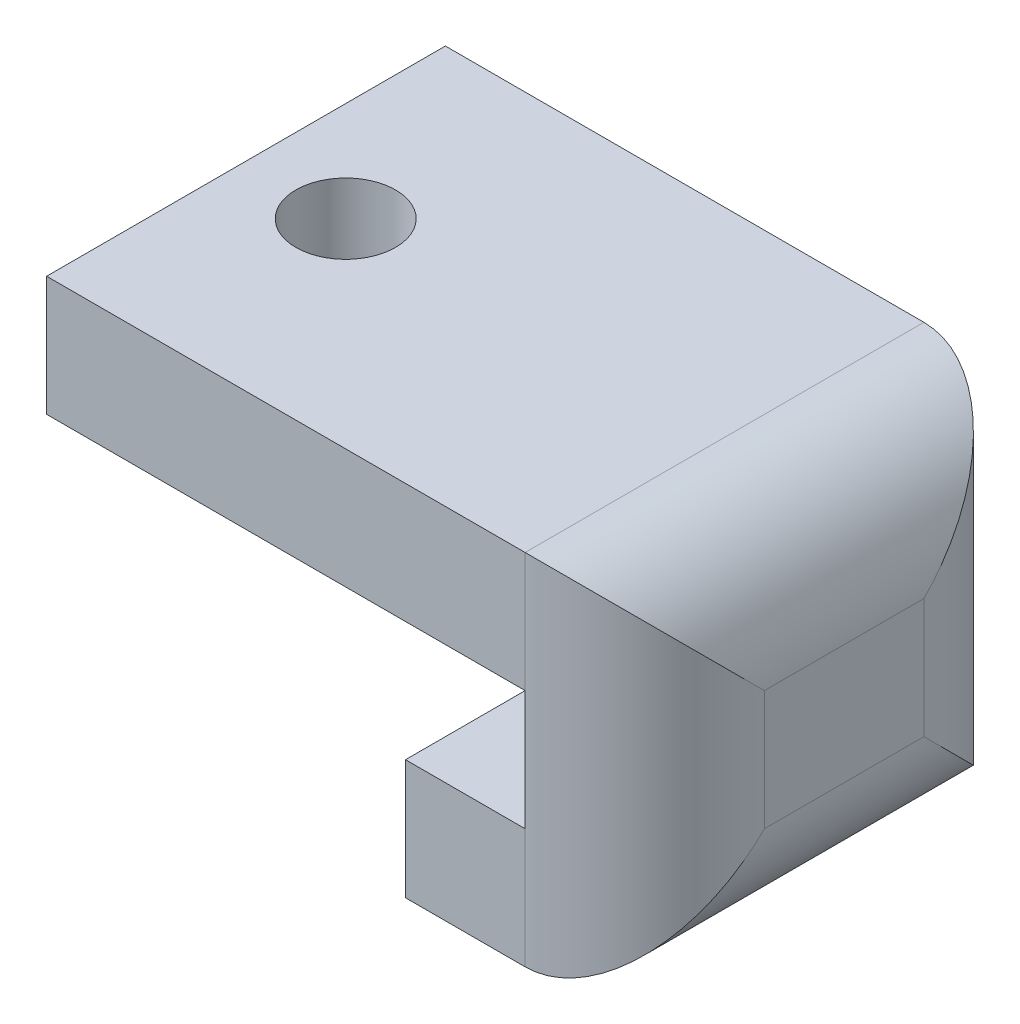
ISO-10303-21;
HEADER;
FILE_DESCRIPTION(('STEP AP214'),'2;1');
FILE_NAME('part.step','',(''),(''),'','','');
FILE_SCHEMA(('AUTOMOTIVE_DESIGN { 1 0 10303 214 1 1 1 1 }'));
ENDSEC;
DATA;
#1=APPLICATION_CONTEXT('core data for automotive mechanical design processes');
#2=APPLICATION_PROTOCOL_DEFINITION('international standard','automotive_design',2000,#1);
#3=PRODUCT_CONTEXT('',#1,'mechanical');
#4=PRODUCT('Part','Part','',(#3));
#5=PRODUCT_RELATED_PRODUCT_CATEGORY('part','',(#4));
#6=PRODUCT_DEFINITION_FORMATION('','',#4);
#7=PRODUCT_DEFINITION_CONTEXT('part definition',#1,'design');
#8=PRODUCT_DEFINITION('design','',#6,#7);
#9=PRODUCT_DEFINITION_SHAPE('','',#8);
#10=(LENGTH_UNIT() NAMED_UNIT(*) SI_UNIT(.MILLI.,.METRE.));
#11=(NAMED_UNIT(*) PLANE_ANGLE_UNIT() SI_UNIT($,.RADIAN.));
#12=(NAMED_UNIT(*) SI_UNIT($,.STERADIAN.) SOLID_ANGLE_UNIT());
#13=UNCERTAINTY_MEASURE_WITH_UNIT(LENGTH_MEASURE(1.E-05),#10,'distance_accuracy_value','');
#14=(GEOMETRIC_REPRESENTATION_CONTEXT(3) GLOBAL_UNCERTAINTY_ASSIGNED_CONTEXT((#13)) GLOBAL_UNIT_ASSIGNED_CONTEXT((#10,
#11,#12)) REPRESENTATION_CONTEXT('',''));
#15=CARTESIAN_POINT('',(0.,0.,0.));
#16=DIRECTION('',(0.,0.,1.));
#17=DIRECTION('',(1.,0.,0.));
#18=AXIS2_PLACEMENT_3D('',#15,#16,#17);
#19=CARTESIAN_POINT('',(0.,0.,0.));
#20=DIRECTION('',(0.,0.,-1.));
#21=DIRECTION('',(-1.,0.,0.));
#22=AXIS2_PLACEMENT_3D('',#19,#20,#21);
#23=PLANE('',#22);
#24=DIRECTION('',(-1.,0.,0.));
#25=VECTOR('',#24,1.);
#26=CARTESIAN_POINT('',(9.,3.,0.));
#27=LINE('',#26,#25);
#28=CARTESIAN_POINT('',(6.,3.,0.));
#29=VERTEX_POINT('',#28);
#30=CARTESIAN_POINT('',(-6.,3.,0.));
#31=VERTEX_POINT('',#30);
#32=EDGE_CURVE('E186',#29,#31,#27,.T.);
#33=ORIENTED_EDGE('',*,*,#32,.F.);
#34=DIRECTION('',(0.,1.,0.));
#35=VECTOR('',#34,1.);
#36=CARTESIAN_POINT('',(6.,-6.,0.));
#37=LINE('',#36,#35);
#38=CARTESIAN_POINT('',(6.,0.,0.));
#39=VERTEX_POINT('',#38);
#40=EDGE_CURVE('E11',#29,#39,#37,.F.);
#41=ORIENTED_EDGE('',*,*,#40,.T.);
#42=DIRECTION('',(1.,0.,0.));
#43=VECTOR('',#42,1.);
#44=CARTESIAN_POINT('',(-6.,0.,0.));
#45=LINE('',#44,#43);
#46=CARTESIAN_POINT('',(-6.,0.,0.));
#47=VERTEX_POINT('',#46);
#48=EDGE_CURVE('E156',#47,#39,#45,.T.);
#49=ORIENTED_EDGE('',*,*,#48,.F.);
#50=DIRECTION('',(0.,-1.,0.));
#51=VECTOR('',#50,1.);
#52=CARTESIAN_POINT('',(-6.,3.,0.));
#53=LINE('',#52,#51);
#54=EDGE_CURVE('E160',#31,#47,#53,.T.);
#55=ORIENTED_EDGE('',*,*,#54,.F.);
#56=EDGE_LOOP('',(#33,#41,#49,#55));
#57=FACE_BOUND('',#56,.T.);
#58=ADVANCED_FACE('F39',(#57),#23,.T.);
#59=CARTESIAN_POINT('',(0.,0.,10.));
#60=DIRECTION('',(0.,0.,-1.));
#61=DIRECTION('',(-1.,0.,0.));
#62=AXIS2_PLACEMENT_3D('',#59,#60,#61);
#63=PLANE('',#62);
#64=DIRECTION('',(1.,0.,0.));
#65=VECTOR('',#64,1.);
#66=CARTESIAN_POINT('',(3.,-6.,10.));
#67=LINE('',#66,#65);
#68=CARTESIAN_POINT('',(3.,-6.,10.));
#69=VERTEX_POINT('',#68);
#70=CARTESIAN_POINT('',(6.,-6.,10.));
#71=VERTEX_POINT('',#70);
#72=EDGE_CURVE('E126',#69,#71,#67,.T.);
#73=ORIENTED_EDGE('',*,*,#72,.T.);
#74=DIRECTION('',(0.,1.,0.));
#75=VECTOR('',#74,1.);
#76=CARTESIAN_POINT('',(6.,0.,10.));
#77=LINE('',#76,#75);
#78=CARTESIAN_POINT('',(6.,-3.,10.));
#79=VERTEX_POINT('',#78);
#80=EDGE_CURVE('E120',#71,#79,#77,.T.);
#81=ORIENTED_EDGE('',*,*,#80,.T.);
#82=DIRECTION('',(-1.,0.,0.));
#83=VECTOR('',#82,1.);
#84=CARTESIAN_POINT('',(6.,-3.,10.));
#85=LINE('',#84,#83);
#86=CARTESIAN_POINT('',(3.,-3.,10.));
#87=VERTEX_POINT('',#86);
#88=EDGE_CURVE('E123',#79,#87,#85,.T.);
#89=ORIENTED_EDGE('',*,*,#88,.T.);
#90=DIRECTION('',(0.,-1.,0.));
#91=VECTOR('',#90,1.);
#92=CARTESIAN_POINT('',(3.,-3.,10.));
#93=LINE('',#92,#91);
#94=EDGE_CURVE('E141',#87,#69,#93,.T.);
#95=ORIENTED_EDGE('',*,*,#94,.T.);
#96=EDGE_LOOP('',(#73,#81,#89,#95));
#97=FACE_BOUND('',#96,.T.);
#98=ADVANCED_FACE('F122',(#97),#63,.F.);
#99=CARTESIAN_POINT('',(6.,0.,10.));
#100=DIRECTION('',(1.,0.,0.));
#101=DIRECTION('',(0.,0.,-1.));
#102=AXIS2_PLACEMENT_3D('',#99,#100,#101);
#103=PLANE('',#102);
#104=DIRECTION('',(0.,-1.,0.));
#105=VECTOR('',#104,1.);
#106=CARTESIAN_POINT('',(6.,0.,0.));
#107=LINE('',#106,#105);
#108=CARTESIAN_POINT('',(6.,-3.,0.));
#109=VERTEX_POINT('',#108);
#110=EDGE_CURVE('E149',#39,#109,#107,.T.);
#111=ORIENTED_EDGE('',*,*,#110,.T.);
#112=DIRECTION('',(0.,0.,-1.));
#113=VECTOR('',#112,1.);
#114=CARTESIAN_POINT('',(6.,-3.,10.));
#115=LINE('',#114,#113);
#116=EDGE_CURVE('E136',#79,#109,#115,.T.);
#117=ORIENTED_EDGE('',*,*,#116,.F.);
#118=DIRECTION('',(0.,-1.,0.));
#119=VECTOR('',#118,1.);
#120=CARTESIAN_POINT('',(6.,0.,10.));
#121=LINE('',#120,#119);
#122=CARTESIAN_POINT('',(6.,0.,10.));
#123=VERTEX_POINT('',#122);
#124=EDGE_CURVE('E142',#123,#79,#121,.T.);
#125=ORIENTED_EDGE('',*,*,#124,.F.);
#126=DIRECTION('',(0.,0.,-1.));
#127=VECTOR('',#126,1.);
#128=CARTESIAN_POINT('',(6.,0.,10.));
#129=LINE('',#128,#127);
#130=EDGE_CURVE('E174',#123,#39,#129,.T.);
#131=ORIENTED_EDGE('',*,*,#130,.T.);
#132=EDGE_LOOP('',(#111,#117,#125,#131));
#133=FACE_BOUND('',#132,.T.);
#134=ADVANCED_FACE('F146',(#133),#103,.F.);
#135=CARTESIAN_POINT('',(6.,-3.,10.));
#136=DIRECTION('',(0.,-1.,0.));
#137=DIRECTION('',(1.,0.,0.));
#138=AXIS2_PLACEMENT_3D('',#135,#136,#137);
#139=PLANE('',#138);
#140=DIRECTION('',(-1.,0.,0.));
#141=VECTOR('',#140,1.);
#142=CARTESIAN_POINT('',(6.,-3.,0.));
#143=LINE('',#142,#141);
#144=CARTESIAN_POINT('',(3.,-3.,0.));
#145=VERTEX_POINT('',#144);
#146=EDGE_CURVE('E177',#109,#145,#143,.T.);
#147=ORIENTED_EDGE('',*,*,#146,.T.);
#148=DIRECTION('',(0.,0.,-1.));
#149=VECTOR('',#148,1.);
#150=CARTESIAN_POINT('',(3.,-3.,10.));
#151=LINE('',#150,#149);
#152=EDGE_CURVE('E139',#87,#145,#151,.T.);
#153=ORIENTED_EDGE('',*,*,#152,.F.);
#154=ORIENTED_EDGE('',*,*,#88,.F.);
#155=ORIENTED_EDGE('',*,*,#116,.T.);
#156=EDGE_LOOP('',(#147,#153,#154,#155));
#157=FACE_BOUND('',#156,.T.);
#158=ADVANCED_FACE('F135',(#157),#139,.F.);
#159=CARTESIAN_POINT('',(3.,-3.,10.));
#160=DIRECTION('',(1.,0.,0.));
#161=DIRECTION('',(0.,1.,0.));
#162=AXIS2_PLACEMENT_3D('',#159,#160,#161);
#163=PLANE('',#162);
#164=DIRECTION('',(0.,-1.,0.));
#165=VECTOR('',#164,1.);
#166=CARTESIAN_POINT('',(3.,-3.,0.));
#167=LINE('',#166,#165);
#168=CARTESIAN_POINT('',(3.,-6.,0.));
#169=VERTEX_POINT('',#168);
#170=EDGE_CURVE('E180',#145,#169,#167,.T.);
#171=ORIENTED_EDGE('',*,*,#170,.T.);
#172=DIRECTION('',(0.,0.,-1.));
#173=VECTOR('',#172,1.);
#174=CARTESIAN_POINT('',(3.,-6.,10.));
#175=LINE('',#174,#173);
#176=EDGE_CURVE('E197',#69,#169,#175,.T.);
#177=ORIENTED_EDGE('',*,*,#176,.F.);
#178=ORIENTED_EDGE('',*,*,#94,.F.);
#179=ORIENTED_EDGE('',*,*,#152,.T.);
#180=EDGE_LOOP('',(#171,#177,#178,#179));
#181=FACE_BOUND('',#180,.T.);
#182=ADVANCED_FACE('F275',(#181),#163,.F.);
#183=CARTESIAN_POINT('',(3.,-6.,10.));
#184=DIRECTION('',(0.,1.,0.));
#185=DIRECTION('',(-1.,0.,0.));
#186=AXIS2_PLACEMENT_3D('',#183,#184,#185);
#187=PLANE('',#186);
#188=DIRECTION('',(1.,0.,0.));
#189=VECTOR('',#188,1.);
#190=CARTESIAN_POINT('',(3.,-6.,0.));
#191=LINE('',#190,#189);
#192=CARTESIAN_POINT('',(6.,-6.,0.));
#193=VERTEX_POINT('',#192);
#194=EDGE_CURVE('E182',#169,#193,#191,.T.);
#195=ORIENTED_EDGE('',*,*,#194,.T.);
#196=DIRECTION('',(0.,0.,-1.));
#197=VECTOR('',#196,1.);
#198=CARTESIAN_POINT('',(6.,-6.,10.));
#199=LINE('',#198,#197);
#200=EDGE_CURVE('E209',#193,#71,#199,.F.);
#201=ORIENTED_EDGE('',*,*,#200,.T.);
#202=ORIENTED_EDGE('',*,*,#72,.F.);
#203=ORIENTED_EDGE('',*,*,#176,.T.);
#204=EDGE_LOOP('',(#195,#201,#202,#203));
#205=FACE_BOUND('',#204,.T.);
#206=ADVANCED_FACE('F271',(#205),#187,.F.);
#207=CARTESIAN_POINT('',(9.,-6.,10.));
#208=DIRECTION('',(-1.,0.,0.));
#209=DIRECTION('',(0.,0.,1.));
#210=AXIS2_PLACEMENT_3D('',#207,#208,#209);
#211=PLANE('',#210);
#212=DIRECTION('',(0.,1.,0.));
#213=VECTOR('',#212,1.);
#214=CARTESIAN_POINT('',(9.,-6.,7.));
#215=LINE('',#214,#213);
#216=CARTESIAN_POINT('',(9.,0.,7.));
#217=VERTEX_POINT('',#216);
#218=CARTESIAN_POINT('',(9.,-3.,7.));
#219=VERTEX_POINT('',#218);
#220=EDGE_CURVE('E204',#217,#219,#215,.F.);
#221=ORIENTED_EDGE('',*,*,#220,.T.);
#222=DIRECTION('',(0.,0.,-1.));
#223=VECTOR('',#222,1.);
#224=CARTESIAN_POINT('',(9.,-3.,10.));
#225=LINE('',#224,#223);
#226=CARTESIAN_POINT('',(9.,-3.,3.));
#227=VERTEX_POINT('',#226);
#228=EDGE_CURVE('E206',#219,#227,#225,.T.);
#229=ORIENTED_EDGE('',*,*,#228,.T.);
#230=DIRECTION('',(0.,1.,0.));
#231=VECTOR('',#230,1.);
#232=CARTESIAN_POINT('',(9.,3.,3.));
#233=LINE('',#232,#231);
#234=CARTESIAN_POINT('',(9.,0.,3.));
#235=VERTEX_POINT('',#234);
#236=EDGE_CURVE('E152',#227,#235,#233,.T.);
#237=ORIENTED_EDGE('',*,*,#236,.T.);
#238=DIRECTION('',(0.,0.,-1.));
#239=VECTOR('',#238,1.);
#240=CARTESIAN_POINT('',(9.,0.,10.));
#241=LINE('',#240,#239);
#242=EDGE_CURVE('E202',#235,#217,#241,.F.);
#243=ORIENTED_EDGE('',*,*,#242,.T.);
#244=EDGE_LOOP('',(#221,#229,#237,#243));
#245=FACE_BOUND('',#244,.T.);
#246=ADVANCED_FACE('F268',(#245),#211,.F.);
#247=CARTESIAN_POINT('',(9.,3.,10.));
#248=DIRECTION('',(0.,-1.,0.));
#249=DIRECTION('',(1.,0.,0.));
#250=AXIS2_PLACEMENT_3D('',#247,#248,#249);
#251=PLANE('',#250);
#252=CARTESIAN_POINT('',(-3.5,3.,5.));
#253=DIRECTION('',(0.,1.,0.));
#254=DIRECTION('',(0.,0.,1.));
#255=AXIS2_PLACEMENT_3D('',#252,#253,#254);
#256=CIRCLE('',#255,1.24999999999999);
#257=CARTESIAN_POINT('',(-3.5,3.,6.24999999999999));
#258=VERTEX_POINT('',#257);
#259=EDGE_CURVE('E394',#258,#258,#256,.T.);
#260=ORIENTED_EDGE('',*,*,#259,.F.);
#261=EDGE_LOOP('',(#260));
#262=FACE_BOUND('',#261,.T.);
#263=DIRECTION('',(-1.,0.,0.));
#264=VECTOR('',#263,1.);
#265=CARTESIAN_POINT('',(9.,3.,10.));
#266=LINE('',#265,#264);
#267=CARTESIAN_POINT('',(6.,3.,10.));
#268=VERTEX_POINT('',#267);
#269=CARTESIAN_POINT('',(-6.,3.,10.));
#270=VERTEX_POINT('',#269);
#271=EDGE_CURVE('E168',#268,#270,#266,.T.);
#272=ORIENTED_EDGE('',*,*,#271,.F.);
#273=DIRECTION('',(0.,0.,-1.));
#274=VECTOR('',#273,1.);
#275=CARTESIAN_POINT('',(6.,3.,10.));
#276=LINE('',#275,#274);
#277=EDGE_CURVE('E56',#268,#29,#276,.T.);
#278=ORIENTED_EDGE('',*,*,#277,.T.);
#279=ORIENTED_EDGE('',*,*,#32,.T.);
#280=DIRECTION('',(0.,0.,-1.));
#281=VECTOR('',#280,1.);
#282=CARTESIAN_POINT('',(-6.,3.,10.));
#283=LINE('',#282,#281);
#284=EDGE_CURVE('E194',#270,#31,#283,.T.);
#285=ORIENTED_EDGE('',*,*,#284,.F.);
#286=EDGE_LOOP('',(#272,#278,#279,#285));
#287=FACE_BOUND('',#286,.T.);
#288=ADVANCED_FACE('F243',(#262,#287),#251,.F.);
#289=CARTESIAN_POINT('',(-6.,3.,10.));
#290=DIRECTION('',(1.,0.,0.));
#291=DIRECTION('',(0.,0.,-1.));
#292=AXIS2_PLACEMENT_3D('',#289,#290,#291);
#293=PLANE('',#292);
#294=ORIENTED_EDGE('',*,*,#54,.T.);
#295=DIRECTION('',(0.,0.,-1.));
#296=VECTOR('',#295,1.);
#297=CARTESIAN_POINT('',(-6.,0.,10.));
#298=LINE('',#297,#296);
#299=CARTESIAN_POINT('',(-6.,0.,10.));
#300=VERTEX_POINT('',#299);
#301=EDGE_CURVE('E191',#300,#47,#298,.T.);
#302=ORIENTED_EDGE('',*,*,#301,.F.);
#303=DIRECTION('',(0.,-1.,0.));
#304=VECTOR('',#303,1.);
#305=CARTESIAN_POINT('',(-6.,3.,10.));
#306=LINE('',#305,#304);
#307=EDGE_CURVE('E170',#270,#300,#306,.T.);
#308=ORIENTED_EDGE('',*,*,#307,.F.);
#309=ORIENTED_EDGE('',*,*,#284,.T.);
#310=EDGE_LOOP('',(#294,#302,#308,#309));
#311=FACE_BOUND('',#310,.T.);
#312=ADVANCED_FACE('F241',(#311),#293,.F.);
#313=CARTESIAN_POINT('',(-6.,0.,10.));
#314=DIRECTION('',(0.,1.,0.));
#315=DIRECTION('',(0.,0.,1.));
#316=AXIS2_PLACEMENT_3D('',#313,#314,#315);
#317=PLANE('',#316);
#318=CARTESIAN_POINT('',(-3.5,0.,5.));
#319=DIRECTION('',(0.,1.,0.));
#320=DIRECTION('',(0.,0.,1.));
#321=AXIS2_PLACEMENT_3D('',#318,#319,#320);
#322=CIRCLE('',#321,1.24999999999999);
#323=CARTESIAN_POINT('',(-3.5,0.,6.24999999999999));
#324=VERTEX_POINT('',#323);
#325=EDGE_CURVE('E163',#324,#324,#322,.T.);
#326=ORIENTED_EDGE('',*,*,#325,.T.);
#327=EDGE_LOOP('',(#326));
#328=FACE_BOUND('',#327,.T.);
#329=ORIENTED_EDGE('',*,*,#48,.T.);
#330=ORIENTED_EDGE('',*,*,#130,.F.);
#331=DIRECTION('',(1.,0.,0.));
#332=VECTOR('',#331,1.);
#333=CARTESIAN_POINT('',(-6.,0.,10.));
#334=LINE('',#333,#332);
#335=EDGE_CURVE('E172',#300,#123,#334,.T.);
#336=ORIENTED_EDGE('',*,*,#335,.F.);
#337=ORIENTED_EDGE('',*,*,#301,.T.);
#338=EDGE_LOOP('',(#329,#330,#336,#337));
#339=FACE_BOUND('',#338,.T.);
#340=ADVANCED_FACE('F236',(#328,#339),#317,.F.);
#341=ORIENTED_EDGE('',*,*,#335,.T.);
#342=DIRECTION('',(0.,1.,0.));
#343=VECTOR('',#342,1.);
#344=CARTESIAN_POINT('',(6.,0.,10.));
#345=LINE('',#344,#343);
#346=EDGE_CURVE('E64',#123,#268,#345,.T.);
#347=ORIENTED_EDGE('',*,*,#346,.T.);
#348=ORIENTED_EDGE('',*,*,#271,.T.);
#349=ORIENTED_EDGE('',*,*,#307,.T.);
#350=EDGE_LOOP('',(#341,#347,#348,#349));
#351=FACE_BOUND('',#350,.T.);
#352=ADVANCED_FACE('F244',(#351),#63,.F.);
#353=ORIENTED_EDGE('',*,*,#146,.F.);
#354=DIRECTION('',(0.,1.,0.));
#355=VECTOR('',#354,1.);
#356=CARTESIAN_POINT('',(6.,-6.,0.));
#357=LINE('',#356,#355);
#358=EDGE_CURVE('E48',#109,#193,#357,.F.);
#359=ORIENTED_EDGE('',*,*,#358,.T.);
#360=ORIENTED_EDGE('',*,*,#194,.F.);
#361=ORIENTED_EDGE('',*,*,#170,.F.);
#362=EDGE_LOOP('',(#353,#359,#360,#361));
#363=FACE_BOUND('',#362,.T.);
#364=ADVANCED_FACE('F246',(#363),#23,.T.);
#365=CARTESIAN_POINT('',(6.,0.,10.));
#366=DIRECTION('',(0.,0.,-1.));
#367=DIRECTION('',(-1.,0.,0.));
#368=AXIS2_PLACEMENT_3D('',#365,#366,#367);
#369=CYLINDRICAL_SURFACE('',#368,3.);
#370=CARTESIAN_POINT('',(6.,0.,3.));
#371=DIRECTION('',(0.,-0.707106781186547,-0.707106781186547));
#372=DIRECTION('',(0.,-0.707106781186547,0.707106781186547));
#373=AXIS2_PLACEMENT_3D('',#370,#371,#372);
#374=ELLIPSE('',#373,4.24264068711928,3.);
#375=EDGE_CURVE('E220',#29,#235,#374,.T.);
#376=ORIENTED_EDGE('',*,*,#375,.F.);
#377=ORIENTED_EDGE('',*,*,#277,.F.);
#378=CARTESIAN_POINT('',(6.,0.,7.));
#379=DIRECTION('',(0.,0.707106781186547,-0.707106781186547));
#380=DIRECTION('',(0.,-0.707106781186547,-0.707106781186547));
#381=AXIS2_PLACEMENT_3D('',#378,#379,#380);
#382=ELLIPSE('',#381,4.24264068711928,3.);
#383=EDGE_CURVE('E43',#217,#268,#382,.F.);
#384=ORIENTED_EDGE('',*,*,#383,.F.);
#385=ORIENTED_EDGE('',*,*,#242,.F.);
#386=EDGE_LOOP('',(#376,#377,#384,#385));
#387=FACE_BOUND('',#386,.T.);
#388=ADVANCED_FACE('F41',(#387),#369,.T.);
#389=CARTESIAN_POINT('',(6.,0.,7.));
#390=DIRECTION('',(0.,1.,0.));
#391=DIRECTION('',(0.,0.,1.));
#392=AXIS2_PLACEMENT_3D('',#389,#390,#391);
#393=CYLINDRICAL_SURFACE('',#392,3.);
#394=ORIENTED_EDGE('',*,*,#124,.T.);
#395=ORIENTED_EDGE('',*,*,#80,.F.);
#396=CARTESIAN_POINT('',(6.,-3.,7.));
#397=DIRECTION('',(0.,0.707106781186547,0.707106781186547));
#398=DIRECTION('',(0.,0.707106781186547,-0.707106781186547));
#399=AXIS2_PLACEMENT_3D('',#396,#397,#398);
#400=ELLIPSE('',#399,4.24264068711928,3.);
#401=EDGE_CURVE('E219',#219,#71,#400,.F.);
#402=ORIENTED_EDGE('',*,*,#401,.F.);
#403=ORIENTED_EDGE('',*,*,#220,.F.);
#404=ORIENTED_EDGE('',*,*,#383,.T.);
#405=ORIENTED_EDGE('',*,*,#346,.F.);
#406=EDGE_LOOP('',(#394,#395,#402,#403,#404,#405));
#407=FACE_BOUND('',#406,.T.);
#408=ADVANCED_FACE('F154',(#407),#393,.T.);
#409=CARTESIAN_POINT('',(6.,-6.,3.));
#410=DIRECTION('',(0.,-1.,0.));
#411=DIRECTION('',(0.,0.,-1.));
#412=AXIS2_PLACEMENT_3D('',#409,#410,#411);
#413=CYLINDRICAL_SURFACE('',#412,3.);
#414=ORIENTED_EDGE('',*,*,#375,.T.);
#415=ORIENTED_EDGE('',*,*,#236,.F.);
#416=CARTESIAN_POINT('',(6.,-3.,3.));
#417=DIRECTION('',(0.,-0.707106781186547,0.707106781186547));
#418=DIRECTION('',(0.,-0.707106781186547,-0.707106781186547));
#419=AXIS2_PLACEMENT_3D('',#416,#417,#418);
#420=ELLIPSE('',#419,4.24264068711928,3.);
#421=EDGE_CURVE('E216',#193,#227,#420,.T.);
#422=ORIENTED_EDGE('',*,*,#421,.F.);
#423=ORIENTED_EDGE('',*,*,#358,.F.);
#424=ORIENTED_EDGE('',*,*,#110,.F.);
#425=ORIENTED_EDGE('',*,*,#40,.F.);
#426=EDGE_LOOP('',(#414,#415,#422,#423,#424,#425));
#427=FACE_BOUND('',#426,.T.);
#428=ADVANCED_FACE('F230',(#427),#413,.T.);
#429=CARTESIAN_POINT('',(6.,-3.,10.));
#430=DIRECTION('',(0.,0.,-1.));
#431=DIRECTION('',(-1.,0.,0.));
#432=AXIS2_PLACEMENT_3D('',#429,#430,#431);
#433=CYLINDRICAL_SURFACE('',#432,3.);
#434=ORIENTED_EDGE('',*,*,#401,.T.);
#435=ORIENTED_EDGE('',*,*,#200,.F.);
#436=ORIENTED_EDGE('',*,*,#421,.T.);
#437=ORIENTED_EDGE('',*,*,#228,.F.);
#438=EDGE_LOOP('',(#434,#435,#436,#437));
#439=FACE_BOUND('',#438,.T.);
#440=ADVANCED_FACE('F284',(#439),#433,.T.);
#441=CARTESIAN_POINT('',(-3.5,3.,5.));
#442=DIRECTION('',(0.,1.,0.));
#443=DIRECTION('',(0.,0.,1.));
#444=AXIS2_PLACEMENT_3D('',#441,#442,#443);
#445=CYLINDRICAL_SURFACE('',#444,1.24999999999999);
#446=ORIENTED_EDGE('',*,*,#259,.T.);
#447=EDGE_LOOP('',(#446));
#448=FACE_BOUND('',#447,.T.);
#449=ORIENTED_EDGE('',*,*,#325,.F.);
#450=EDGE_LOOP('',(#449));
#451=FACE_BOUND('',#450,.T.);
#452=ADVANCED_FACE('F287',(#448,#451),#445,.F.);
#453=CLOSED_SHELL('',(#58,#98,#134,#158,#182,#206,#246,#288,#312,#340,#352,#364,#388,#408,#428,
#440,#452));
#454=MANIFOLD_SOLID_BREP('B2',#453);
#455=ADVANCED_BREP_SHAPE_REPRESENTATION('',(#18,#454),#14);
#456=SHAPE_DEFINITION_REPRESENTATION(#9,#455);
ENDSEC;
END-ISO-10303-21;
